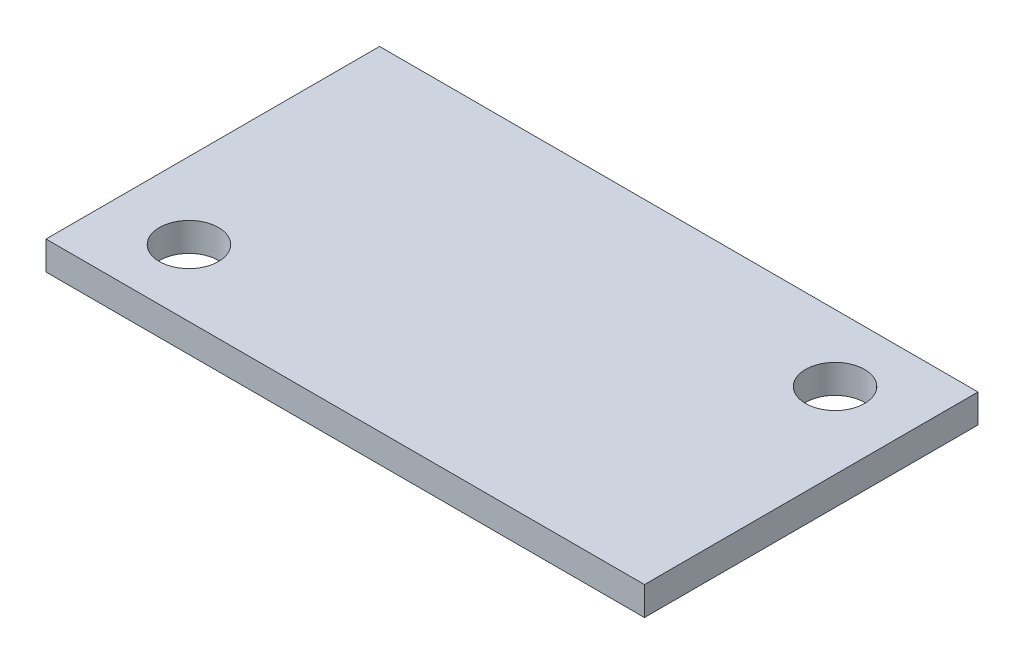
ISO-10303-21;
HEADER;
FILE_DESCRIPTION(('STEP AP214'),'2;1');
FILE_NAME('part.step','',(''),(''),'','','');
FILE_SCHEMA(('AUTOMOTIVE_DESIGN { 1 0 10303 214 1 1 1 1 }'));
ENDSEC;
DATA;
#1=APPLICATION_CONTEXT('core data for automotive mechanical design processes');
#2=APPLICATION_PROTOCOL_DEFINITION('international standard','automotive_design',2000,#1);
#3=PRODUCT_CONTEXT('',#1,'mechanical');
#4=PRODUCT('Part','Part','',(#3));
#5=PRODUCT_RELATED_PRODUCT_CATEGORY('part','',(#4));
#6=PRODUCT_DEFINITION_FORMATION('','',#4);
#7=PRODUCT_DEFINITION_CONTEXT('part definition',#1,'design');
#8=PRODUCT_DEFINITION('design','',#6,#7);
#9=PRODUCT_DEFINITION_SHAPE('','',#8);
#10=(LENGTH_UNIT() NAMED_UNIT(*) SI_UNIT(.MILLI.,.METRE.));
#11=(NAMED_UNIT(*) PLANE_ANGLE_UNIT() SI_UNIT($,.RADIAN.));
#12=(NAMED_UNIT(*) SI_UNIT($,.STERADIAN.) SOLID_ANGLE_UNIT());
#13=UNCERTAINTY_MEASURE_WITH_UNIT(LENGTH_MEASURE(1.E-05),#10,'distance_accuracy_value','');
#14=(GEOMETRIC_REPRESENTATION_CONTEXT(3) GLOBAL_UNCERTAINTY_ASSIGNED_CONTEXT((#13)) GLOBAL_UNIT_ASSIGNED_CONTEXT((#10,
#11,#12)) REPRESENTATION_CONTEXT('',''));
#15=CARTESIAN_POINT('',(0.,0.,0.));
#16=DIRECTION('',(0.,0.,1.));
#17=DIRECTION('',(1.,0.,0.));
#18=AXIS2_PLACEMENT_3D('',#15,#16,#17);
#19=CARTESIAN_POINT('',(337.460462116191,-25.8164347629501,-459.778787136622));
#20=DIRECTION('',(1.,0.,0.));
#21=DIRECTION('',(0.,1.,0.));
#22=AXIS2_PLACEMENT_3D('',#19,#20,#21);
#23=PLANE('',#22);
#24=DIRECTION('',(0.,1.,0.));
#25=VECTOR('',#24,1.);
#26=CARTESIAN_POINT('',(337.460462116191,-24.0664347629502,-460.528787136622));
#27=LINE('',#26,#25);
#28=CARTESIAN_POINT('',(337.460462116191,-25.0664347629502,-460.528787136622));
#29=VERTEX_POINT('',#28);
#30=CARTESIAN_POINT('',(337.460462116191,-24.0664347629502,-460.528787136622));
#31=VERTEX_POINT('',#30);
#32=EDGE_CURVE('E226',#29,#31,#27,.T.);
#33=ORIENTED_EDGE('',*,*,#32,.F.);
#34=DIRECTION('',(0.,0.,1.));
#35=VECTOR('',#34,1.);
#36=CARTESIAN_POINT('',(337.460462116191,-25.0664347629502,-460.528787136622));
#37=LINE('',#36,#35);
#38=CARTESIAN_POINT('',(337.460462116191,-25.0664347629502,-461.528787136622));
#39=VERTEX_POINT('',#38);
#40=EDGE_CURVE('E235',#39,#29,#37,.T.);
#41=ORIENTED_EDGE('',*,*,#40,.F.);
#42=DIRECTION('',(0.,-1.,0.));
#43=VECTOR('',#42,1.);
#44=CARTESIAN_POINT('',(337.460462116191,-24.0664347629502,-461.528787136622));
#45=LINE('',#44,#43);
#46=CARTESIAN_POINT('',(337.460462116191,-24.0664347629502,-461.528787136622));
#47=VERTEX_POINT('',#46);
#48=EDGE_CURVE('E247',#47,#39,#45,.T.);
#49=ORIENTED_EDGE('',*,*,#48,.F.);
#50=DIRECTION('',(0.,0.,-1.));
#51=VECTOR('',#50,1.);
#52=CARTESIAN_POINT('',(337.460462116191,-24.0664347629502,-460.528787136622));
#53=LINE('',#52,#51);
#54=EDGE_CURVE('E244',#31,#47,#53,.T.);
#55=ORIENTED_EDGE('',*,*,#54,.F.);
#56=EDGE_LOOP('',(#33,#41,#49,#55));
#57=FACE_BOUND('',#56,.T.);
#58=DIRECTION('',(0.,0.,-1.));
#59=VECTOR('',#58,1.);
#60=CARTESIAN_POINT('',(337.460462116191,-23.3164347629501,-459.778787136622));
#61=LINE('',#60,#59);
#62=CARTESIAN_POINT('',(337.460462116191,-23.3164347629502,-459.778787136622));
#63=VERTEX_POINT('',#62);
#64=CARTESIAN_POINT('',(337.460462116191,-23.3164347629502,-467.278787136622));
#65=VERTEX_POINT('',#64);
#66=EDGE_CURVE('E277',#63,#65,#61,.T.);
#67=ORIENTED_EDGE('',*,*,#66,.T.);
#68=DIRECTION('',(0.,1.,0.));
#69=VECTOR('',#68,1.);
#70=CARTESIAN_POINT('',(337.460462116191,-25.8164347629501,-467.278787136622));
#71=LINE('',#70,#69);
#72=CARTESIAN_POINT('',(337.460462116191,-25.8164347629501,-467.278787136622));
#73=VERTEX_POINT('',#72);
#74=EDGE_CURVE('E290',#73,#65,#71,.T.);
#75=ORIENTED_EDGE('',*,*,#74,.F.);
#76=DIRECTION('',(0.,0.,-1.));
#77=VECTOR('',#76,1.);
#78=CARTESIAN_POINT('',(337.460462116191,-25.8164347629501,-459.778787136622));
#79=LINE('',#78,#77);
#80=CARTESIAN_POINT('',(337.460462116191,-25.8164347629501,-459.778787136622));
#81=VERTEX_POINT('',#80);
#82=EDGE_CURVE('E267',#81,#73,#79,.T.);
#83=ORIENTED_EDGE('',*,*,#82,.F.);
#84=DIRECTION('',(0.,1.,0.));
#85=VECTOR('',#84,1.);
#86=CARTESIAN_POINT('',(337.460462116191,-25.8164347629501,-459.778787136622));
#87=LINE('',#86,#85);
#88=EDGE_CURVE('E293',#81,#63,#87,.T.);
#89=ORIENTED_EDGE('',*,*,#88,.T.);
#90=EDGE_LOOP('',(#67,#75,#83,#89));
#91=FACE_BOUND('',#90,.T.);
#92=DIRECTION('',(0.,1.,0.));
#93=VECTOR('',#92,1.);
#94=CARTESIAN_POINT('',(337.460462116191,-24.0664347629502,-463.028787136622));
#95=LINE('',#94,#93);
#96=CARTESIAN_POINT('',(337.460462116191,-25.0664347629502,-463.028787136622));
#97=VERTEX_POINT('',#96);
#98=CARTESIAN_POINT('',(337.460462116191,-24.0664347629502,-463.028787136622));
#99=VERTEX_POINT('',#98);
#100=EDGE_CURVE('E223',#97,#99,#95,.T.);
#101=ORIENTED_EDGE('',*,*,#100,.F.);
#102=DIRECTION('',(0.,0.,1.));
#103=VECTOR('',#102,1.);
#104=CARTESIAN_POINT('',(337.460462116191,-25.0664347629502,-463.028787136622));
#105=LINE('',#104,#103);
#106=CARTESIAN_POINT('',(337.460462116191,-25.0664347629502,-464.028787136622));
#107=VERTEX_POINT('',#106);
#108=EDGE_CURVE('E209',#107,#97,#105,.T.);
#109=ORIENTED_EDGE('',*,*,#108,.F.);
#110=DIRECTION('',(0.,-1.,0.));
#111=VECTOR('',#110,1.);
#112=CARTESIAN_POINT('',(337.460462116191,-24.0664347629502,-464.028787136622));
#113=LINE('',#112,#111);
#114=CARTESIAN_POINT('',(337.460462116191,-24.0664347629502,-464.028787136622));
#115=VERTEX_POINT('',#114);
#116=EDGE_CURVE('E544',#115,#107,#113,.T.);
#117=ORIENTED_EDGE('',*,*,#116,.F.);
#118=DIRECTION('',(0.,0.,-1.));
#119=VECTOR('',#118,1.);
#120=CARTESIAN_POINT('',(337.460462116191,-24.0664347629502,-463.028787136622));
#121=LINE('',#120,#119);
#122=EDGE_CURVE('E224',#99,#115,#121,.T.);
#123=ORIENTED_EDGE('',*,*,#122,.F.);
#124=EDGE_LOOP('',(#101,#109,#117,#123));
#125=FACE_BOUND('',#124,.T.);
#126=DIRECTION('',(0.,1.,0.));
#127=VECTOR('',#126,1.);
#128=CARTESIAN_POINT('',(337.460462116191,-24.0664347629502,-465.528787136622));
#129=LINE('',#128,#127);
#130=CARTESIAN_POINT('',(337.460462116191,-25.0664347629502,-465.528787136622));
#131=VERTEX_POINT('',#130);
#132=CARTESIAN_POINT('',(337.460462116191,-24.0664347629502,-465.528787136622));
#133=VERTEX_POINT('',#132);
#134=EDGE_CURVE('E371',#131,#133,#129,.T.);
#135=ORIENTED_EDGE('',*,*,#134,.F.);
#136=DIRECTION('',(0.,0.,1.));
#137=VECTOR('',#136,1.);
#138=CARTESIAN_POINT('',(337.460462116191,-25.0664347629502,-465.528787136622));
#139=LINE('',#138,#137);
#140=CARTESIAN_POINT('',(337.460462116191,-25.0664347629502,-466.528787136622));
#141=VERTEX_POINT('',#140);
#142=EDGE_CURVE('E373',#141,#131,#139,.T.);
#143=ORIENTED_EDGE('',*,*,#142,.F.);
#144=DIRECTION('',(0.,-1.,0.));
#145=VECTOR('',#144,1.);
#146=CARTESIAN_POINT('',(337.460462116191,-24.0664347629502,-466.528787136622));
#147=LINE('',#146,#145);
#148=CARTESIAN_POINT('',(337.460462116191,-24.0664347629502,-466.528787136622));
#149=VERTEX_POINT('',#148);
#150=EDGE_CURVE('E376',#149,#141,#147,.T.);
#151=ORIENTED_EDGE('',*,*,#150,.F.);
#152=DIRECTION('',(0.,0.,-1.));
#153=VECTOR('',#152,1.);
#154=CARTESIAN_POINT('',(337.460462116191,-24.0664347629502,-465.528787136622));
#155=LINE('',#154,#153);
#156=EDGE_CURVE('E378',#133,#149,#155,.T.);
#157=ORIENTED_EDGE('',*,*,#156,.F.);
#158=EDGE_LOOP('',(#135,#143,#151,#157));
#159=FACE_BOUND('',#158,.T.);
#160=ADVANCED_FACE('F34',(#57,#91,#125,#159),#23,.F.);
#161=CARTESIAN_POINT('',(0.,-23.3164347629503,0.));
#162=DIRECTION('',(0.,1.,0.));
#163=DIRECTION('',(-1.,0.,0.));
#164=AXIS2_PLACEMENT_3D('',#161,#162,#163);
#165=PLANE('',#164);
#166=DIRECTION('',(0.,0.,-1.));
#167=VECTOR('',#166,1.);
#168=CARTESIAN_POINT('',(347.210462116191,-23.3164347629502,-457.828787136622));
#169=LINE('',#168,#167);
#170=CARTESIAN_POINT('',(347.210462116191,-23.3164347629502,-456.228787136622));
#171=VERTEX_POINT('',#170);
#172=CARTESIAN_POINT('',(347.210462116191,-23.3164347629502,-457.828787136622));
#173=VERTEX_POINT('',#172);
#174=EDGE_CURVE('E296',#171,#173,#169,.T.);
#175=ORIENTED_EDGE('',*,*,#174,.F.);
#176=DIRECTION('',(-1.,0.,0.));
#177=VECTOR('',#176,1.);
#178=CARTESIAN_POINT('',(347.210462116191,-23.3164347629502,-456.228787136622));
#179=LINE('',#178,#177);
#180=CARTESIAN_POINT('',(350.110462116191,-23.3164347629502,-456.228787136622));
#181=VERTEX_POINT('',#180);
#182=EDGE_CURVE('E301',#181,#171,#179,.T.);
#183=ORIENTED_EDGE('',*,*,#182,.F.);
#184=DIRECTION('',(0.,0.,1.));
#185=VECTOR('',#184,1.);
#186=CARTESIAN_POINT('',(350.110462116191,-23.3164347629502,-457.828787136622));
#187=LINE('',#186,#185);
#188=CARTESIAN_POINT('',(350.110462116191,-23.3164347629502,-457.828787136622));
#189=VERTEX_POINT('',#188);
#190=EDGE_CURVE('E313',#189,#181,#187,.T.);
#191=ORIENTED_EDGE('',*,*,#190,.F.);
#192=DIRECTION('',(1.,0.,0.));
#193=VECTOR('',#192,1.);
#194=CARTESIAN_POINT('',(347.210462116191,-23.3164347629502,-457.828787136622));
#195=LINE('',#194,#193);
#196=EDGE_CURVE('E310',#173,#189,#195,.T.);
#197=ORIENTED_EDGE('',*,*,#196,.F.);
#198=EDGE_LOOP('',(#175,#183,#191,#197));
#199=FACE_BOUND('',#198,.T.);
#200=CARTESIAN_POINT('',(335.460462116191,-23.3164347629502,-455.028787136622));
#201=DIRECTION('',(0.,-1.,0.));
#202=DIRECTION('',(1.,0.,0.));
#203=AXIS2_PLACEMENT_3D('',#200,#201,#202);
#204=CIRCLE('',#203,1.55);
#205=CARTESIAN_POINT('',(337.010462116191,-23.3164347629502,-455.028787136622));
#206=VERTEX_POINT('',#205);
#207=EDGE_CURVE('E329',#206,#206,#204,.T.);
#208=ORIENTED_EDGE('',*,*,#207,.F.);
#209=EDGE_LOOP('',(#208));
#210=FACE_BOUND('',#209,.T.);
#211=CARTESIAN_POINT('',(358.86046211619,-23.3164347629501,-465.528787136622));
#212=DIRECTION('',(0.,-1.,0.));
#213=DIRECTION('',(1.,0.,0.));
#214=AXIS2_PLACEMENT_3D('',#211,#212,#213);
#215=CIRCLE('',#214,1.55);
#216=CARTESIAN_POINT('',(360.410462116191,-23.3164347629501,-465.528787136622));
#217=VERTEX_POINT('',#216);
#218=EDGE_CURVE('E333',#217,#217,#215,.T.);
#219=ORIENTED_EDGE('',*,*,#218,.F.);
#220=EDGE_LOOP('',(#219));
#221=FACE_BOUND('',#220,.T.);
#222=DIRECTION('',(0.,0.,-1.));
#223=VECTOR('',#222,1.);
#224=CARTESIAN_POINT('',(331.460462116191,-23.3164347629502,-469.028787136622));
#225=LINE('',#224,#223);
#226=CARTESIAN_POINT('',(331.460462116191,-23.3164347629502,-451.528787136622));
#227=VERTEX_POINT('',#226);
#228=CARTESIAN_POINT('',(331.460462116191,-23.3164347629502,-469.028787136622));
#229=VERTEX_POINT('',#228);
#230=EDGE_CURVE('E342',#227,#229,#225,.T.);
#231=ORIENTED_EDGE('',*,*,#230,.T.);
#232=DIRECTION('',(1.,0.,0.));
#233=VECTOR('',#232,1.);
#234=CARTESIAN_POINT('',(331.460462116191,-23.3164347629502,-469.028787136622));
#235=LINE('',#234,#233);
#236=CARTESIAN_POINT('',(362.86046211619,-23.3164347629502,-469.028787136622));
#237=VERTEX_POINT('',#236);
#238=EDGE_CURVE('E345',#229,#237,#235,.T.);
#239=ORIENTED_EDGE('',*,*,#238,.T.);
#240=DIRECTION('',(0.,0.,1.));
#241=VECTOR('',#240,1.);
#242=CARTESIAN_POINT('',(362.86046211619,-23.3164347629502,-469.028787136622));
#243=LINE('',#242,#241);
#244=CARTESIAN_POINT('',(362.86046211619,-23.3164347629502,-451.528787136622));
#245=VERTEX_POINT('',#244);
#246=EDGE_CURVE('E348',#237,#245,#243,.T.);
#247=ORIENTED_EDGE('',*,*,#246,.T.);
#248=DIRECTION('',(-1.,0.,0.));
#249=VECTOR('',#248,1.);
#250=CARTESIAN_POINT('',(331.460462116191,-23.3164347629502,-451.528787136622));
#251=LINE('',#250,#249);
#252=EDGE_CURVE('E350',#245,#227,#251,.T.);
#253=ORIENTED_EDGE('',*,*,#252,.T.);
#254=EDGE_LOOP('',(#231,#239,#247,#253));
#255=FACE_BOUND('',#254,.T.);
#256=DIRECTION('',(-1.,0.,0.));
#257=VECTOR('',#256,1.);
#258=CARTESIAN_POINT('',(337.460462116191,-23.3164347629501,-459.778787136622));
#259=LINE('',#258,#257);
#260=CARTESIAN_POINT('',(340.460462116191,-23.3164347629501,-459.778787136622));
#261=VERTEX_POINT('',#260);
#262=EDGE_CURVE('E263',#261,#63,#259,.T.);
#263=ORIENTED_EDGE('',*,*,#262,.F.);
#264=DIRECTION('',(0.,0.,1.));
#265=VECTOR('',#264,1.);
#266=CARTESIAN_POINT('',(340.460462116191,-23.3164347629501,-459.778787136622));
#267=LINE('',#266,#265);
#268=CARTESIAN_POINT('',(340.460462116191,-23.3164347629502,-467.278787136622));
#269=VERTEX_POINT('',#268);
#270=EDGE_CURVE('E268',#269,#261,#267,.T.);
#271=ORIENTED_EDGE('',*,*,#270,.F.);
#272=DIRECTION('',(1.,0.,0.));
#273=VECTOR('',#272,1.);
#274=CARTESIAN_POINT('',(337.460462116191,-23.3164347629501,-467.278787136622));
#275=LINE('',#274,#273);
#276=EDGE_CURVE('E280',#65,#269,#275,.T.);
#277=ORIENTED_EDGE('',*,*,#276,.F.);
#278=ORIENTED_EDGE('',*,*,#66,.F.);
#279=EDGE_LOOP('',(#263,#271,#277,#278));
#280=FACE_BOUND('',#279,.T.);
#281=ADVANCED_FACE('F404',(#199,#210,#221,#255,#280),#165,.F.);
#282=CARTESIAN_POINT('',(331.460462116191,-23.3164347629502,-469.028787136622));
#283=DIRECTION('',(1.,0.,0.));
#284=DIRECTION('',(0.,1.,0.));
#285=AXIS2_PLACEMENT_3D('',#282,#283,#284);
#286=PLANE('',#285);
#287=DIRECTION('',(0.,0.,-1.));
#288=VECTOR('',#287,1.);
#289=CARTESIAN_POINT('',(331.460462116191,-21.8164347629502,-469.028787136622));
#290=LINE('',#289,#288);
#291=CARTESIAN_POINT('',(331.460462116191,-21.8164347629502,-451.528787136622));
#292=VERTEX_POINT('',#291);
#293=CARTESIAN_POINT('',(331.460462116191,-21.8164347629502,-469.028787136622));
#294=VERTEX_POINT('',#293);
#295=EDGE_CURVE('E339',#292,#294,#290,.T.);
#296=ORIENTED_EDGE('',*,*,#295,.T.);
#297=DIRECTION('',(0.,1.,0.));
#298=VECTOR('',#297,1.);
#299=CARTESIAN_POINT('',(331.460462116191,-23.3164347629502,-469.028787136622));
#300=LINE('',#299,#298);
#301=EDGE_CURVE('E368',#229,#294,#300,.T.);
#302=ORIENTED_EDGE('',*,*,#301,.F.);
#303=ORIENTED_EDGE('',*,*,#230,.F.);
#304=DIRECTION('',(0.,1.,0.));
#305=VECTOR('',#304,1.);
#306=CARTESIAN_POINT('',(331.460462116191,-23.3164347629502,-451.528787136622));
#307=LINE('',#306,#305);
#308=EDGE_CURVE('E352',#227,#292,#307,.T.);
#309=ORIENTED_EDGE('',*,*,#308,.T.);
#310=EDGE_LOOP('',(#296,#302,#303,#309));
#311=FACE_BOUND('',#310,.T.);
#312=ADVANCED_FACE('F410',(#311),#286,.F.);
#313=CARTESIAN_POINT('',(331.460462116191,-23.3164347629502,-469.028787136622));
#314=DIRECTION('',(0.,0.,1.));
#315=DIRECTION('',(0.,-1.,0.));
#316=AXIS2_PLACEMENT_3D('',#313,#314,#315);
#317=PLANE('',#316);
#318=DIRECTION('',(1.,0.,0.));
#319=VECTOR('',#318,1.);
#320=CARTESIAN_POINT('',(331.460462116191,-21.8164347629502,-469.028787136622));
#321=LINE('',#320,#319);
#322=CARTESIAN_POINT('',(362.86046211619,-21.8164347629501,-469.028787136622));
#323=VERTEX_POINT('',#322);
#324=EDGE_CURVE('E355',#294,#323,#321,.T.);
#325=ORIENTED_EDGE('',*,*,#324,.T.);
#326=DIRECTION('',(0.,1.,0.));
#327=VECTOR('',#326,1.);
#328=CARTESIAN_POINT('',(362.86046211619,-23.3164347629502,-469.028787136622));
#329=LINE('',#328,#327);
#330=EDGE_CURVE('E365',#237,#323,#329,.T.);
#331=ORIENTED_EDGE('',*,*,#330,.F.);
#332=ORIENTED_EDGE('',*,*,#238,.F.);
#333=ORIENTED_EDGE('',*,*,#301,.T.);
#334=EDGE_LOOP('',(#325,#331,#332,#333));
#335=FACE_BOUND('',#334,.T.);
#336=ADVANCED_FACE('F461',(#335),#317,.F.);
#337=CARTESIAN_POINT('',(362.86046211619,-23.3164347629502,-469.028787136622));
#338=DIRECTION('',(-1.,0.,0.));
#339=DIRECTION('',(0.,-1.,0.));
#340=AXIS2_PLACEMENT_3D('',#337,#338,#339);
#341=PLANE('',#340);
#342=DIRECTION('',(0.,0.,1.));
#343=VECTOR('',#342,1.);
#344=CARTESIAN_POINT('',(362.86046211619,-21.8164347629501,-469.028787136622));
#345=LINE('',#344,#343);
#346=CARTESIAN_POINT('',(362.86046211619,-21.8164347629501,-451.528787136622));
#347=VERTEX_POINT('',#346);
#348=EDGE_CURVE('E357',#323,#347,#345,.T.);
#349=ORIENTED_EDGE('',*,*,#348,.T.);
#350=DIRECTION('',(0.,1.,0.));
#351=VECTOR('',#350,1.);
#352=CARTESIAN_POINT('',(362.86046211619,-23.3164347629502,-451.528787136622));
#353=LINE('',#352,#351);
#354=EDGE_CURVE('E362',#245,#347,#353,.T.);
#355=ORIENTED_EDGE('',*,*,#354,.F.);
#356=ORIENTED_EDGE('',*,*,#246,.F.);
#357=ORIENTED_EDGE('',*,*,#330,.T.);
#358=EDGE_LOOP('',(#349,#355,#356,#357));
#359=FACE_BOUND('',#358,.T.);
#360=ADVANCED_FACE('F457',(#359),#341,.F.);
#361=CARTESIAN_POINT('',(331.460462116191,-23.3164347629502,-451.528787136622));
#362=DIRECTION('',(0.,0.,-1.));
#363=DIRECTION('',(0.,1.,0.));
#364=AXIS2_PLACEMENT_3D('',#361,#362,#363);
#365=PLANE('',#364);
#366=DIRECTION('',(-1.,0.,0.));
#367=VECTOR('',#366,1.);
#368=CARTESIAN_POINT('',(331.460462116191,-21.8164347629502,-451.528787136622));
#369=LINE('',#368,#367);
#370=EDGE_CURVE('E346',#347,#292,#369,.T.);
#371=ORIENTED_EDGE('',*,*,#370,.T.);
#372=ORIENTED_EDGE('',*,*,#308,.F.);
#373=ORIENTED_EDGE('',*,*,#252,.F.);
#374=ORIENTED_EDGE('',*,*,#354,.T.);
#375=EDGE_LOOP('',(#371,#372,#373,#374));
#376=FACE_BOUND('',#375,.T.);
#377=ADVANCED_FACE('F453',(#376),#365,.F.);
#378=CARTESIAN_POINT('',(0.,-21.8164347629503,0.));
#379=DIRECTION('',(0.,1.,0.));
#380=DIRECTION('',(-1.,0.,0.));
#381=AXIS2_PLACEMENT_3D('',#378,#379,#380);
#382=PLANE('',#381);
#383=CARTESIAN_POINT('',(335.460462116191,-21.8164347629502,-455.028787136622));
#384=DIRECTION('',(0.,-1.,0.));
#385=DIRECTION('',(1.,0.,0.));
#386=AXIS2_PLACEMENT_3D('',#383,#384,#385);
#387=CIRCLE('',#386,1.55);
#388=CARTESIAN_POINT('',(337.010462116191,-21.8164347629502,-455.028787136622));
#389=VERTEX_POINT('',#388);
#390=EDGE_CURVE('E330',#389,#389,#387,.T.);
#391=ORIENTED_EDGE('',*,*,#390,.T.);
#392=EDGE_LOOP('',(#391));
#393=FACE_BOUND('',#392,.T.);
#394=CARTESIAN_POINT('',(358.86046211619,-21.8164347629501,-465.528787136622));
#395=DIRECTION('',(0.,-1.,0.));
#396=DIRECTION('',(1.,0.,0.));
#397=AXIS2_PLACEMENT_3D('',#394,#395,#396);
#398=CIRCLE('',#397,1.55);
#399=CARTESIAN_POINT('',(360.410462116191,-21.8164347629501,-465.528787136622));
#400=VERTEX_POINT('',#399);
#401=EDGE_CURVE('E336',#400,#400,#398,.T.);
#402=ORIENTED_EDGE('',*,*,#401,.T.);
#403=EDGE_LOOP('',(#402));
#404=FACE_BOUND('',#403,.T.);
#405=ORIENTED_EDGE('',*,*,#295,.F.);
#406=ORIENTED_EDGE('',*,*,#370,.F.);
#407=ORIENTED_EDGE('',*,*,#348,.F.);
#408=ORIENTED_EDGE('',*,*,#324,.F.);
#409=EDGE_LOOP('',(#405,#406,#407,#408));
#410=FACE_BOUND('',#409,.T.);
#411=ADVANCED_FACE('F448',(#393,#404,#410),#382,.T.);
#412=CARTESIAN_POINT('',(358.86046211619,-21.8164347629501,-465.528787136622));
#413=DIRECTION('',(0.,-1.,0.));
#414=DIRECTION('',(1.,0.,0.));
#415=AXIS2_PLACEMENT_3D('',#412,#413,#414);
#416=CYLINDRICAL_SURFACE('',#415,1.55);
#417=ORIENTED_EDGE('',*,*,#401,.F.);
#418=EDGE_LOOP('',(#417));
#419=FACE_BOUND('',#418,.T.);
#420=ORIENTED_EDGE('',*,*,#218,.T.);
#421=EDGE_LOOP('',(#420));
#422=FACE_BOUND('',#421,.T.);
#423=ADVANCED_FACE('F445',(#419,#422),#416,.F.);
#424=CARTESIAN_POINT('',(335.460462116191,-21.8164347629502,-455.028787136622));
#425=DIRECTION('',(0.,-1.,0.));
#426=DIRECTION('',(1.,0.,0.));
#427=AXIS2_PLACEMENT_3D('',#424,#425,#426);
#428=CYLINDRICAL_SURFACE('',#427,1.55);
#429=ORIENTED_EDGE('',*,*,#390,.F.);
#430=EDGE_LOOP('',(#429));
#431=FACE_BOUND('',#430,.T.);
#432=ORIENTED_EDGE('',*,*,#207,.T.);
#433=EDGE_LOOP('',(#432));
#434=FACE_BOUND('',#433,.T.);
#435=ADVANCED_FACE('F441',(#431,#434),#428,.F.);
#436=CARTESIAN_POINT('',(347.210462116191,-25.1164347629501,-457.828787136622));
#437=DIRECTION('',(1.,0.,0.));
#438=DIRECTION('',(0.,1.,0.));
#439=AXIS2_PLACEMENT_3D('',#436,#437,#438);
#440=PLANE('',#439);
#441=ORIENTED_EDGE('',*,*,#174,.T.);
#442=DIRECTION('',(0.,1.,0.));
#443=VECTOR('',#442,1.);
#444=CARTESIAN_POINT('',(347.210462116191,-25.1164347629501,-457.828787136622));
#445=LINE('',#444,#443);
#446=CARTESIAN_POINT('',(347.210462116191,-25.1164347629501,-457.828787136622));
#447=VERTEX_POINT('',#446);
#448=EDGE_CURVE('E326',#447,#173,#445,.T.);
#449=ORIENTED_EDGE('',*,*,#448,.F.);
#450=DIRECTION('',(0.,0.,-1.));
#451=VECTOR('',#450,1.);
#452=CARTESIAN_POINT('',(347.210462116191,-25.1164347629501,-457.828787136622));
#453=LINE('',#452,#451);
#454=CARTESIAN_POINT('',(347.210462116191,-25.1164347629501,-456.228787136622));
#455=VERTEX_POINT('',#454);
#456=EDGE_CURVE('E297',#455,#447,#453,.T.);
#457=ORIENTED_EDGE('',*,*,#456,.F.);
#458=DIRECTION('',(0.,1.,0.));
#459=VECTOR('',#458,1.);
#460=CARTESIAN_POINT('',(347.210462116191,-25.1164347629501,-456.228787136622));
#461=LINE('',#460,#459);
#462=EDGE_CURVE('E307',#455,#171,#461,.T.);
#463=ORIENTED_EDGE('',*,*,#462,.T.);
#464=EDGE_LOOP('',(#441,#449,#457,#463));
#465=FACE_BOUND('',#464,.T.);
#466=ADVANCED_FACE('F437',(#465),#440,.F.);
#467=CARTESIAN_POINT('',(347.210462116191,-25.1164347629501,-457.828787136622));
#468=DIRECTION('',(0.,0.,1.));
#469=DIRECTION('',(1.,0.,0.));
#470=AXIS2_PLACEMENT_3D('',#467,#468,#469);
#471=PLANE('',#470);
#472=ORIENTED_EDGE('',*,*,#196,.T.);
#473=DIRECTION('',(0.,1.,0.));
#474=VECTOR('',#473,1.);
#475=CARTESIAN_POINT('',(350.110462116191,-25.1164347629501,-457.828787136622));
#476=LINE('',#475,#474);
#477=CARTESIAN_POINT('',(350.110462116191,-25.1164347629501,-457.828787136622));
#478=VERTEX_POINT('',#477);
#479=EDGE_CURVE('E323',#478,#189,#476,.T.);
#480=ORIENTED_EDGE('',*,*,#479,.F.);
#481=DIRECTION('',(1.,0.,0.));
#482=VECTOR('',#481,1.);
#483=CARTESIAN_POINT('',(347.210462116191,-25.1164347629501,-457.828787136622));
#484=LINE('',#483,#482);
#485=EDGE_CURVE('E300',#447,#478,#484,.T.);
#486=ORIENTED_EDGE('',*,*,#485,.F.);
#487=ORIENTED_EDGE('',*,*,#448,.T.);
#488=EDGE_LOOP('',(#472,#480,#486,#487));
#489=FACE_BOUND('',#488,.T.);
#490=ADVANCED_FACE('F433',(#489),#471,.F.);
#491=CARTESIAN_POINT('',(350.110462116191,-25.1164347629501,-457.828787136622));
#492=DIRECTION('',(-1.,0.,0.));
#493=DIRECTION('',(0.,-1.,0.));
#494=AXIS2_PLACEMENT_3D('',#491,#492,#493);
#495=PLANE('',#494);
#496=ORIENTED_EDGE('',*,*,#190,.T.);
#497=DIRECTION('',(0.,1.,0.));
#498=VECTOR('',#497,1.);
#499=CARTESIAN_POINT('',(350.110462116191,-25.1164347629501,-456.228787136622));
#500=LINE('',#499,#498);
#501=CARTESIAN_POINT('',(350.110462116191,-25.1164347629501,-456.228787136622));
#502=VERTEX_POINT('',#501);
#503=EDGE_CURVE('E320',#502,#181,#500,.T.);
#504=ORIENTED_EDGE('',*,*,#503,.F.);
#505=DIRECTION('',(0.,0.,1.));
#506=VECTOR('',#505,1.);
#507=CARTESIAN_POINT('',(350.110462116191,-25.1164347629501,-457.828787136622));
#508=LINE('',#507,#506);
#509=EDGE_CURVE('E303',#478,#502,#508,.T.);
#510=ORIENTED_EDGE('',*,*,#509,.F.);
#511=ORIENTED_EDGE('',*,*,#479,.T.);
#512=EDGE_LOOP('',(#496,#504,#510,#511));
#513=FACE_BOUND('',#512,.T.);
#514=ADVANCED_FACE('F429',(#513),#495,.F.);
#515=CARTESIAN_POINT('',(347.210462116191,-25.1164347629501,-456.228787136622));
#516=DIRECTION('',(0.,0.,-1.));
#517=DIRECTION('',(-1.,0.,0.));
#518=AXIS2_PLACEMENT_3D('',#515,#516,#517);
#519=PLANE('',#518);
#520=ORIENTED_EDGE('',*,*,#182,.T.);
#521=ORIENTED_EDGE('',*,*,#462,.F.);
#522=DIRECTION('',(-1.,0.,0.));
#523=VECTOR('',#522,1.);
#524=CARTESIAN_POINT('',(347.210462116191,-25.1164347629501,-456.228787136622));
#525=LINE('',#524,#523);
#526=EDGE_CURVE('E305',#502,#455,#525,.T.);
#527=ORIENTED_EDGE('',*,*,#526,.F.);
#528=ORIENTED_EDGE('',*,*,#503,.T.);
#529=EDGE_LOOP('',(#520,#521,#527,#528));
#530=FACE_BOUND('',#529,.T.);
#531=ADVANCED_FACE('F425',(#530),#519,.F.);
#532=CARTESIAN_POINT('',(0.,-25.1164347629501,0.));
#533=DIRECTION('',(0.,1.,0.));
#534=DIRECTION('',(0.,0.,1.));
#535=AXIS2_PLACEMENT_3D('',#532,#533,#534);
#536=PLANE('',#535);
#537=ORIENTED_EDGE('',*,*,#456,.T.);
#538=ORIENTED_EDGE('',*,*,#485,.T.);
#539=ORIENTED_EDGE('',*,*,#509,.T.);
#540=ORIENTED_EDGE('',*,*,#526,.T.);
#541=EDGE_LOOP('',(#537,#538,#539,#540));
#542=FACE_BOUND('',#541,.T.);
#543=ADVANCED_FACE('F421',(#542),#536,.F.);
#544=CARTESIAN_POINT('',(337.460462116191,-25.8164347629501,-459.778787136622));
#545=DIRECTION('',(0.,0.,-1.));
#546=DIRECTION('',(-1.,0.,0.));
#547=AXIS2_PLACEMENT_3D('',#544,#545,#546);
#548=PLANE('',#547);
#549=ORIENTED_EDGE('',*,*,#262,.T.);
#550=ORIENTED_EDGE('',*,*,#88,.F.);
#551=DIRECTION('',(-1.,0.,0.));
#552=VECTOR('',#551,1.);
#553=CARTESIAN_POINT('',(337.460462116191,-25.8164347629501,-459.778787136622));
#554=LINE('',#553,#552);
#555=CARTESIAN_POINT('',(340.460462116191,-25.8164347629501,-459.778787136622));
#556=VERTEX_POINT('',#555);
#557=EDGE_CURVE('E264',#556,#81,#554,.T.);
#558=ORIENTED_EDGE('',*,*,#557,.F.);
#559=DIRECTION('',(0.,1.,0.));
#560=VECTOR('',#559,1.);
#561=CARTESIAN_POINT('',(340.460462116191,-25.8164347629501,-459.778787136622));
#562=LINE('',#561,#560);
#563=EDGE_CURVE('E274',#556,#261,#562,.T.);
#564=ORIENTED_EDGE('',*,*,#563,.T.);
#565=EDGE_LOOP('',(#549,#550,#558,#564));
#566=FACE_BOUND('',#565,.T.);
#567=ADVANCED_FACE('F418',(#566),#548,.F.);
#568=CARTESIAN_POINT('',(337.460462116191,-25.8164347629501,-467.278787136622));
#569=DIRECTION('',(0.,0.,1.));
#570=DIRECTION('',(1.,0.,0.));
#571=AXIS2_PLACEMENT_3D('',#568,#569,#570);
#572=PLANE('',#571);
#573=ORIENTED_EDGE('',*,*,#276,.T.);
#574=DIRECTION('',(0.,1.,0.));
#575=VECTOR('',#574,1.);
#576=CARTESIAN_POINT('',(340.460462116191,-25.8164347629501,-467.278787136622));
#577=LINE('',#576,#575);
#578=CARTESIAN_POINT('',(340.460462116191,-25.8164347629501,-467.278787136622));
#579=VERTEX_POINT('',#578);
#580=EDGE_CURVE('E287',#579,#269,#577,.T.);
#581=ORIENTED_EDGE('',*,*,#580,.F.);
#582=DIRECTION('',(1.,0.,0.));
#583=VECTOR('',#582,1.);
#584=CARTESIAN_POINT('',(337.460462116191,-25.8164347629501,-467.278787136622));
#585=LINE('',#584,#583);
#586=EDGE_CURVE('E270',#73,#579,#585,.T.);
#587=ORIENTED_EDGE('',*,*,#586,.F.);
#588=ORIENTED_EDGE('',*,*,#74,.T.);
#589=EDGE_LOOP('',(#573,#581,#587,#588));
#590=FACE_BOUND('',#589,.T.);
#591=ADVANCED_FACE('F416',(#590),#572,.F.);
#592=CARTESIAN_POINT('',(340.460462116191,-25.8164347629501,-459.778787136622));
#593=DIRECTION('',(-1.,0.,0.));
#594=DIRECTION('',(0.,-1.,0.));
#595=AXIS2_PLACEMENT_3D('',#592,#593,#594);
#596=PLANE('',#595);
#597=ORIENTED_EDGE('',*,*,#270,.T.);
#598=ORIENTED_EDGE('',*,*,#563,.F.);
#599=DIRECTION('',(0.,0.,1.));
#600=VECTOR('',#599,1.);
#601=CARTESIAN_POINT('',(340.460462116191,-25.8164347629501,-459.778787136622));
#602=LINE('',#601,#600);
#603=EDGE_CURVE('E272',#579,#556,#602,.T.);
#604=ORIENTED_EDGE('',*,*,#603,.F.);
#605=ORIENTED_EDGE('',*,*,#580,.T.);
#606=EDGE_LOOP('',(#597,#598,#604,#605));
#607=FACE_BOUND('',#606,.T.);
#608=ADVANCED_FACE('F519',(#607),#596,.F.);
#609=CARTESIAN_POINT('',(0.,-25.8164347629505,0.));
#610=DIRECTION('',(0.,1.,0.));
#611=DIRECTION('',(-1.,0.,0.));
#612=AXIS2_PLACEMENT_3D('',#609,#610,#611);
#613=PLANE('',#612);
#614=ORIENTED_EDGE('',*,*,#557,.T.);
#615=ORIENTED_EDGE('',*,*,#82,.T.);
#616=ORIENTED_EDGE('',*,*,#586,.T.);
#617=ORIENTED_EDGE('',*,*,#603,.T.);
#618=EDGE_LOOP('',(#614,#615,#616,#617));
#619=FACE_BOUND('',#618,.T.);
#620=ADVANCED_FACE('F516',(#619),#613,.F.);
#621=CARTESIAN_POINT('',(331.660462116191,-24.0664347629502,-460.528787136622));
#622=DIRECTION('',(0.,0.,-1.));
#623=DIRECTION('',(-1.,0.,0.));
#624=AXIS2_PLACEMENT_3D('',#621,#622,#623);
#625=PLANE('',#624);
#626=ORIENTED_EDGE('',*,*,#32,.T.);
#627=DIRECTION('',(1.,0.,0.));
#628=VECTOR('',#627,1.);
#629=CARTESIAN_POINT('',(331.660462116191,-24.0664347629502,-460.528787136622));
#630=LINE('',#629,#628);
#631=CARTESIAN_POINT('',(331.660462116191,-24.0664347629502,-460.528787136622));
#632=VERTEX_POINT('',#631);
#633=EDGE_CURVE('E260',#632,#31,#630,.T.);
#634=ORIENTED_EDGE('',*,*,#633,.F.);
#635=DIRECTION('',(0.,1.,0.));
#636=VECTOR('',#635,1.);
#637=CARTESIAN_POINT('',(331.660462116191,-24.0664347629502,-460.528787136622));
#638=LINE('',#637,#636);
#639=CARTESIAN_POINT('',(331.660462116191,-25.0664347629502,-460.528787136622));
#640=VERTEX_POINT('',#639);
#641=EDGE_CURVE('E231',#640,#632,#638,.T.);
#642=ORIENTED_EDGE('',*,*,#641,.F.);
#643=DIRECTION('',(1.,0.,0.));
#644=VECTOR('',#643,1.);
#645=CARTESIAN_POINT('',(331.660462116191,-25.0664347629502,-460.528787136622));
#646=LINE('',#645,#644);
#647=EDGE_CURVE('E241',#640,#29,#646,.T.);
#648=ORIENTED_EDGE('',*,*,#647,.T.);
#649=EDGE_LOOP('',(#626,#634,#642,#648));
#650=FACE_BOUND('',#649,.T.);
#651=ADVANCED_FACE('F512',(#650),#625,.F.);
#652=CARTESIAN_POINT('',(331.660462116191,-24.0664347629502,-460.528787136622));
#653=DIRECTION('',(0.,-1.,0.));
#654=DIRECTION('',(1.,0.,0.));
#655=AXIS2_PLACEMENT_3D('',#652,#653,#654);
#656=PLANE('',#655);
#657=ORIENTED_EDGE('',*,*,#54,.T.);
#658=DIRECTION('',(1.,0.,0.));
#659=VECTOR('',#658,1.);
#660=CARTESIAN_POINT('',(331.660462116191,-24.0664347629502,-461.528787136622));
#661=LINE('',#660,#659);
#662=CARTESIAN_POINT('',(331.660462116191,-24.0664347629502,-461.528787136622));
#663=VERTEX_POINT('',#662);
#664=EDGE_CURVE('E257',#663,#47,#661,.T.);
#665=ORIENTED_EDGE('',*,*,#664,.F.);
#666=DIRECTION('',(0.,0.,-1.));
#667=VECTOR('',#666,1.);
#668=CARTESIAN_POINT('',(331.660462116191,-24.0664347629502,-460.528787136622));
#669=LINE('',#668,#667);
#670=EDGE_CURVE('E234',#632,#663,#669,.T.);
#671=ORIENTED_EDGE('',*,*,#670,.F.);
#672=ORIENTED_EDGE('',*,*,#633,.T.);
#673=EDGE_LOOP('',(#657,#665,#671,#672));
#674=FACE_BOUND('',#673,.T.);
#675=ADVANCED_FACE('F508',(#674),#656,.F.);
#676=CARTESIAN_POINT('',(331.660462116191,-24.0664347629502,-461.528787136622));
#677=DIRECTION('',(0.,0.,1.));
#678=DIRECTION('',(1.,0.,0.));
#679=AXIS2_PLACEMENT_3D('',#676,#677,#678);
#680=PLANE('',#679);
#681=ORIENTED_EDGE('',*,*,#48,.T.);
#682=DIRECTION('',(1.,0.,0.));
#683=VECTOR('',#682,1.);
#684=CARTESIAN_POINT('',(331.660462116191,-25.0664347629502,-461.528787136622));
#685=LINE('',#684,#683);
#686=CARTESIAN_POINT('',(331.660462116191,-25.0664347629502,-461.528787136622));
#687=VERTEX_POINT('',#686);
#688=EDGE_CURVE('E254',#687,#39,#685,.T.);
#689=ORIENTED_EDGE('',*,*,#688,.F.);
#690=DIRECTION('',(0.,-1.,0.));
#691=VECTOR('',#690,1.);
#692=CARTESIAN_POINT('',(331.660462116191,-24.0664347629502,-461.528787136622));
#693=LINE('',#692,#691);
#694=EDGE_CURVE('E237',#663,#687,#693,.T.);
#695=ORIENTED_EDGE('',*,*,#694,.F.);
#696=ORIENTED_EDGE('',*,*,#664,.T.);
#697=EDGE_LOOP('',(#681,#689,#695,#696));
#698=FACE_BOUND('',#697,.T.);
#699=ADVANCED_FACE('F504',(#698),#680,.F.);
#700=CARTESIAN_POINT('',(331.660462116191,-25.0664347629502,-460.528787136622));
#701=DIRECTION('',(0.,1.,0.));
#702=DIRECTION('',(-1.,0.,0.));
#703=AXIS2_PLACEMENT_3D('',#700,#701,#702);
#704=PLANE('',#703);
#705=ORIENTED_EDGE('',*,*,#40,.T.);
#706=ORIENTED_EDGE('',*,*,#647,.F.);
#707=DIRECTION('',(0.,0.,1.));
#708=VECTOR('',#707,1.);
#709=CARTESIAN_POINT('',(331.660462116191,-25.0664347629502,-460.528787136622));
#710=LINE('',#709,#708);
#711=EDGE_CURVE('E239',#687,#640,#710,.T.);
#712=ORIENTED_EDGE('',*,*,#711,.F.);
#713=ORIENTED_EDGE('',*,*,#688,.T.);
#714=EDGE_LOOP('',(#705,#706,#712,#713));
#715=FACE_BOUND('',#714,.T.);
#716=ADVANCED_FACE('F500',(#715),#704,.F.);
#717=CARTESIAN_POINT('',(331.660462116191,0.,0.));
#718=DIRECTION('',(1.,0.,0.));
#719=DIRECTION('',(0.,0.,-1.));
#720=AXIS2_PLACEMENT_3D('',#717,#718,#719);
#721=PLANE('',#720);
#722=ORIENTED_EDGE('',*,*,#641,.T.);
#723=ORIENTED_EDGE('',*,*,#670,.T.);
#724=ORIENTED_EDGE('',*,*,#694,.T.);
#725=ORIENTED_EDGE('',*,*,#711,.T.);
#726=EDGE_LOOP('',(#722,#723,#724,#725));
#727=FACE_BOUND('',#726,.T.);
#728=ADVANCED_FACE('F497',(#727),#721,.F.);
#729=CARTESIAN_POINT('',(331.660462116191,-24.0664347629502,-463.028787136622));
#730=DIRECTION('',(0.,0.,-1.));
#731=DIRECTION('',(-1.,0.,0.));
#732=AXIS2_PLACEMENT_3D('',#729,#730,#731);
#733=PLANE('',#732);
#734=ORIENTED_EDGE('',*,*,#100,.T.);
#735=DIRECTION('',(1.,0.,0.));
#736=VECTOR('',#735,1.);
#737=CARTESIAN_POINT('',(331.660462116191,-24.0664347629502,-463.028787136622));
#738=LINE('',#737,#736);
#739=CARTESIAN_POINT('',(331.660462116191,-24.0664347629502,-463.028787136622));
#740=VERTEX_POINT('',#739);
#741=EDGE_CURVE('E216',#740,#99,#738,.T.);
#742=ORIENTED_EDGE('',*,*,#741,.F.);
#743=DIRECTION('',(0.,1.,0.));
#744=VECTOR('',#743,1.);
#745=CARTESIAN_POINT('',(331.660462116191,-24.0664347629502,-463.028787136622));
#746=LINE('',#745,#744);
#747=CARTESIAN_POINT('',(331.660462116191,-25.0664347629502,-463.028787136622));
#748=VERTEX_POINT('',#747);
#749=EDGE_CURVE('E198',#748,#740,#746,.T.);
#750=ORIENTED_EDGE('',*,*,#749,.F.);
#751=DIRECTION('',(1.,0.,0.));
#752=VECTOR('',#751,1.);
#753=CARTESIAN_POINT('',(331.660462116191,-25.0664347629502,-463.028787136622));
#754=LINE('',#753,#752);
#755=EDGE_CURVE('E538',#748,#97,#754,.T.);
#756=ORIENTED_EDGE('',*,*,#755,.T.);
#757=EDGE_LOOP('',(#734,#742,#750,#756));
#758=FACE_BOUND('',#757,.T.);
#759=ADVANCED_FACE('F222',(#758),#733,.F.);
#760=CARTESIAN_POINT('',(331.660462116191,-24.0664347629502,-463.028787136622));
#761=DIRECTION('',(0.,-1.,0.));
#762=DIRECTION('',(1.,0.,0.));
#763=AXIS2_PLACEMENT_3D('',#760,#761,#762);
#764=PLANE('',#763);
#765=ORIENTED_EDGE('',*,*,#122,.T.);
#766=DIRECTION('',(1.,0.,0.));
#767=VECTOR('',#766,1.);
#768=CARTESIAN_POINT('',(331.660462116191,-24.0664347629502,-464.028787136622));
#769=LINE('',#768,#767);
#770=CARTESIAN_POINT('',(331.660462116191,-24.0664347629502,-464.028787136622));
#771=VERTEX_POINT('',#770);
#772=EDGE_CURVE('E219',#771,#115,#769,.T.);
#773=ORIENTED_EDGE('',*,*,#772,.F.);
#774=DIRECTION('',(0.,0.,-1.));
#775=VECTOR('',#774,1.);
#776=CARTESIAN_POINT('',(331.660462116191,-24.0664347629502,-463.028787136622));
#777=LINE('',#776,#775);
#778=EDGE_CURVE('E201',#740,#771,#777,.T.);
#779=ORIENTED_EDGE('',*,*,#778,.F.);
#780=ORIENTED_EDGE('',*,*,#741,.T.);
#781=EDGE_LOOP('',(#765,#773,#779,#780));
#782=FACE_BOUND('',#781,.T.);
#783=ADVANCED_FACE('F215',(#782),#764,.F.);
#784=CARTESIAN_POINT('',(331.660462116191,-24.0664347629502,-464.028787136622));
#785=DIRECTION('',(0.,0.,1.));
#786=DIRECTION('',(1.,0.,0.));
#787=AXIS2_PLACEMENT_3D('',#784,#785,#786);
#788=PLANE('',#787);
#789=ORIENTED_EDGE('',*,*,#116,.T.);
#790=DIRECTION('',(1.,0.,0.));
#791=VECTOR('',#790,1.);
#792=CARTESIAN_POINT('',(331.660462116191,-25.0664347629502,-464.028787136622));
#793=LINE('',#792,#791);
#794=CARTESIAN_POINT('',(331.660462116191,-25.0664347629502,-464.028787136622));
#795=VERTEX_POINT('',#794);
#796=EDGE_CURVE('E540',#795,#107,#793,.T.);
#797=ORIENTED_EDGE('',*,*,#796,.F.);
#798=DIRECTION('',(0.,-1.,0.));
#799=VECTOR('',#798,1.);
#800=CARTESIAN_POINT('',(331.660462116191,-24.0664347629502,-464.028787136622));
#801=LINE('',#800,#799);
#802=EDGE_CURVE('E220',#771,#795,#801,.T.);
#803=ORIENTED_EDGE('',*,*,#802,.F.);
#804=ORIENTED_EDGE('',*,*,#772,.T.);
#805=EDGE_LOOP('',(#789,#797,#803,#804));
#806=FACE_BOUND('',#805,.T.);
#807=ADVANCED_FACE('F486',(#806),#788,.F.);
#808=CARTESIAN_POINT('',(331.660462116191,-25.0664347629502,-463.028787136622));
#809=DIRECTION('',(0.,1.,0.));
#810=DIRECTION('',(-1.,0.,0.));
#811=AXIS2_PLACEMENT_3D('',#808,#809,#810);
#812=PLANE('',#811);
#813=ORIENTED_EDGE('',*,*,#108,.T.);
#814=ORIENTED_EDGE('',*,*,#755,.F.);
#815=DIRECTION('',(0.,0.,1.));
#816=VECTOR('',#815,1.);
#817=CARTESIAN_POINT('',(331.660462116191,-25.0664347629502,-463.028787136622));
#818=LINE('',#817,#816);
#819=EDGE_CURVE('E204',#795,#748,#818,.T.);
#820=ORIENTED_EDGE('',*,*,#819,.F.);
#821=ORIENTED_EDGE('',*,*,#796,.T.);
#822=EDGE_LOOP('',(#813,#814,#820,#821));
#823=FACE_BOUND('',#822,.T.);
#824=ADVANCED_FACE('F481',(#823),#812,.F.);
#825=CARTESIAN_POINT('',(331.660462116191,0.,-2.5));
#826=DIRECTION('',(1.,0.,0.));
#827=DIRECTION('',(0.,0.,-1.));
#828=AXIS2_PLACEMENT_3D('',#825,#826,#827);
#829=PLANE('',#828);
#830=ORIENTED_EDGE('',*,*,#749,.T.);
#831=ORIENTED_EDGE('',*,*,#778,.T.);
#832=ORIENTED_EDGE('',*,*,#802,.T.);
#833=ORIENTED_EDGE('',*,*,#819,.T.);
#834=EDGE_LOOP('',(#830,#831,#832,#833));
#835=FACE_BOUND('',#834,.T.);
#836=ADVANCED_FACE('F200',(#835),#829,.F.);
#837=CARTESIAN_POINT('',(331.660462116191,0.,-5.));
#838=DIRECTION('',(1.,0.,0.));
#839=DIRECTION('',(0.,0.,-1.));
#840=AXIS2_PLACEMENT_3D('',#837,#838,#839);
#841=PLANE('',#840);
#842=DIRECTION('',(0.,1.,0.));
#843=VECTOR('',#842,1.);
#844=CARTESIAN_POINT('',(331.660462116191,-24.0664347629502,-465.528787136622));
#845=LINE('',#844,#843);
#846=CARTESIAN_POINT('',(331.660462116191,-25.0664347629502,-465.528787136622));
#847=VERTEX_POINT('',#846);
#848=CARTESIAN_POINT('',(331.660462116191,-24.0664347629502,-465.528787136622));
#849=VERTEX_POINT('',#848);
#850=EDGE_CURVE('E383',#847,#849,#845,.T.);
#851=ORIENTED_EDGE('',*,*,#850,.T.);
#852=DIRECTION('',(0.,0.,-1.));
#853=VECTOR('',#852,1.);
#854=CARTESIAN_POINT('',(331.660462116191,-24.0664347629502,-465.528787136622));
#855=LINE('',#854,#853);
#856=CARTESIAN_POINT('',(331.660462116191,-24.0664347629502,-466.528787136622));
#857=VERTEX_POINT('',#856);
#858=EDGE_CURVE('E390',#849,#857,#855,.T.);
#859=ORIENTED_EDGE('',*,*,#858,.T.);
#860=DIRECTION('',(0.,-1.,0.));
#861=VECTOR('',#860,1.);
#862=CARTESIAN_POINT('',(331.660462116191,-24.0664347629502,-466.528787136622));
#863=LINE('',#862,#861);
#864=CARTESIAN_POINT('',(331.660462116191,-25.0664347629502,-466.528787136622));
#865=VERTEX_POINT('',#864);
#866=EDGE_CURVE('E42',#857,#865,#863,.T.);
#867=ORIENTED_EDGE('',*,*,#866,.T.);
#868=DIRECTION('',(0.,0.,1.));
#869=VECTOR('',#868,1.);
#870=CARTESIAN_POINT('',(331.660462116191,-25.0664347629502,-465.528787136622));
#871=LINE('',#870,#869);
#872=EDGE_CURVE('E11',#865,#847,#871,.T.);
#873=ORIENTED_EDGE('',*,*,#872,.T.);
#874=EDGE_LOOP('',(#851,#859,#867,#873));
#875=FACE_BOUND('',#874,.T.);
#876=ADVANCED_FACE('F36',(#875),#841,.F.);
#877=CARTESIAN_POINT('',(331.660462116191,-25.0664347629502,-465.528787136622));
#878=DIRECTION('',(0.,1.,0.));
#879=DIRECTION('',(-1.,0.,0.));
#880=AXIS2_PLACEMENT_3D('',#877,#878,#879);
#881=PLANE('',#880);
#882=ORIENTED_EDGE('',*,*,#142,.T.);
#883=DIRECTION('',(1.,0.,0.));
#884=VECTOR('',#883,1.);
#885=CARTESIAN_POINT('',(331.660462116191,-25.0664347629502,-465.528787136622));
#886=LINE('',#885,#884);
#887=EDGE_CURVE('E386',#847,#131,#886,.T.);
#888=ORIENTED_EDGE('',*,*,#887,.F.);
#889=ORIENTED_EDGE('',*,*,#872,.F.);
#890=DIRECTION('',(1.,0.,0.));
#891=VECTOR('',#890,1.);
#892=CARTESIAN_POINT('',(331.660462116191,-25.0664347629502,-466.528787136622));
#893=LINE('',#892,#891);
#894=EDGE_CURVE('E49',#865,#141,#893,.T.);
#895=ORIENTED_EDGE('',*,*,#894,.T.);
#896=EDGE_LOOP('',(#882,#888,#889,#895));
#897=FACE_BOUND('',#896,.T.);
#898=ADVANCED_FACE('F396',(#897),#881,.F.);
#899=CARTESIAN_POINT('',(331.660462116191,-24.0664347629502,-466.528787136622));
#900=DIRECTION('',(0.,0.,1.));
#901=DIRECTION('',(1.,0.,0.));
#902=AXIS2_PLACEMENT_3D('',#899,#900,#901);
#903=PLANE('',#902);
#904=ORIENTED_EDGE('',*,*,#150,.T.);
#905=ORIENTED_EDGE('',*,*,#894,.F.);
#906=ORIENTED_EDGE('',*,*,#866,.F.);
#907=DIRECTION('',(1.,0.,0.));
#908=VECTOR('',#907,1.);
#909=CARTESIAN_POINT('',(331.660462116191,-24.0664347629502,-466.528787136622));
#910=LINE('',#909,#908);
#911=EDGE_CURVE('E57',#857,#149,#910,.T.);
#912=ORIENTED_EDGE('',*,*,#911,.T.);
#913=EDGE_LOOP('',(#904,#905,#906,#912));
#914=FACE_BOUND('',#913,.T.);
#915=ADVANCED_FACE('F402',(#914),#903,.F.);
#916=CARTESIAN_POINT('',(331.660462116191,-24.0664347629502,-465.528787136622));
#917=DIRECTION('',(0.,-1.,0.));
#918=DIRECTION('',(1.,0.,0.));
#919=AXIS2_PLACEMENT_3D('',#916,#917,#918);
#920=PLANE('',#919);
#921=ORIENTED_EDGE('',*,*,#156,.T.);
#922=ORIENTED_EDGE('',*,*,#911,.F.);
#923=ORIENTED_EDGE('',*,*,#858,.F.);
#924=DIRECTION('',(1.,0.,0.));
#925=VECTOR('',#924,1.);
#926=CARTESIAN_POINT('',(331.660462116191,-24.0664347629502,-465.528787136622));
#927=LINE('',#926,#925);
#928=EDGE_CURVE('E380',#849,#133,#927,.T.);
#929=ORIENTED_EDGE('',*,*,#928,.T.);
#930=EDGE_LOOP('',(#921,#922,#923,#929));
#931=FACE_BOUND('',#930,.T.);
#932=ADVANCED_FACE('F400',(#931),#920,.F.);
#933=CARTESIAN_POINT('',(331.660462116191,-24.0664347629502,-465.528787136622));
#934=DIRECTION('',(0.,0.,-1.));
#935=DIRECTION('',(-1.,0.,0.));
#936=AXIS2_PLACEMENT_3D('',#933,#934,#935);
#937=PLANE('',#936);
#938=ORIENTED_EDGE('',*,*,#134,.T.);
#939=ORIENTED_EDGE('',*,*,#928,.F.);
#940=ORIENTED_EDGE('',*,*,#850,.F.);
#941=ORIENTED_EDGE('',*,*,#887,.T.);
#942=EDGE_LOOP('',(#938,#939,#940,#941));
#943=FACE_BOUND('',#942,.T.);
#944=ADVANCED_FACE('F398',(#943),#937,.F.);
#945=CLOSED_SHELL('',(#160,#281,#312,#336,#360,#377,#411,#423,#435,#466,#490,#514,#531,#543,
#567,#591,#608,#620,#651,#675,#699,#716,#728,#759,#783,#807,#824,#836,#876,#898,#915,#932,#944));
#946=MANIFOLD_SOLID_BREP('B2',#945);
#947=ADVANCED_BREP_SHAPE_REPRESENTATION('',(#18,#946),#14);
#948=SHAPE_DEFINITION_REPRESENTATION(#9,#947);
ENDSEC;
END-ISO-10303-21;
